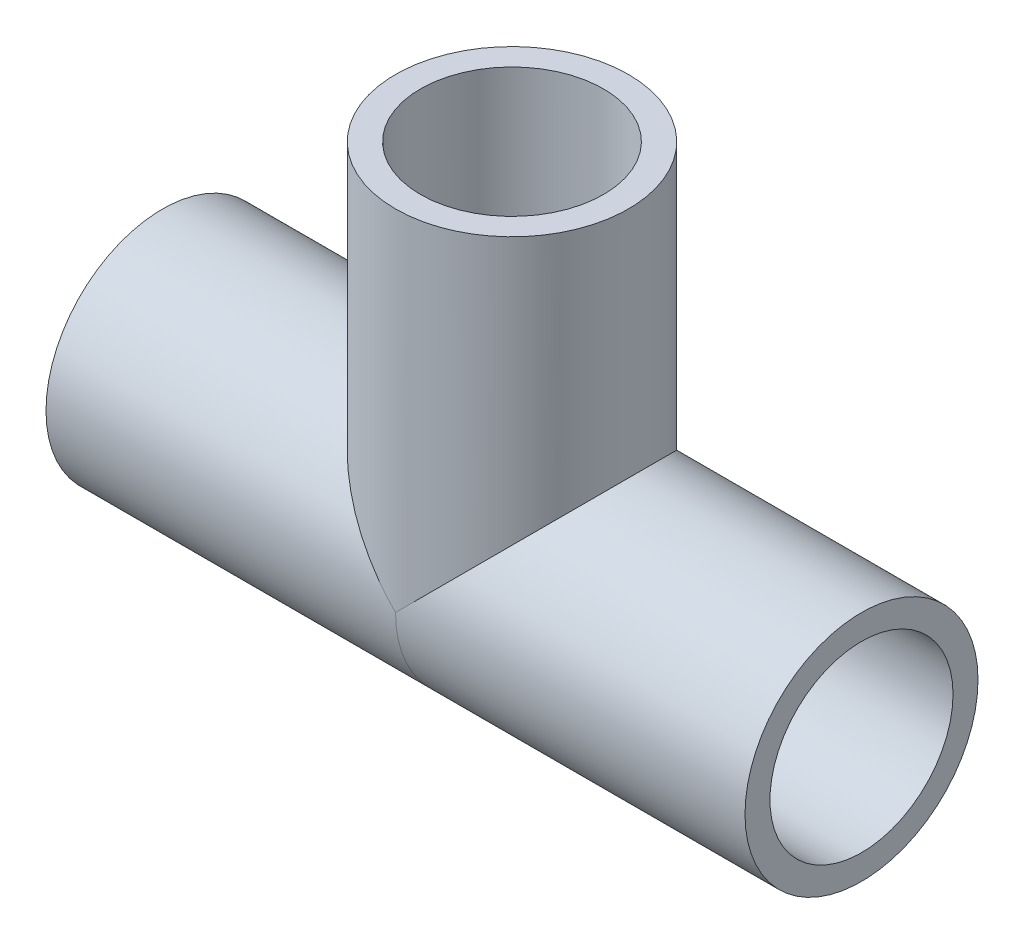
ISO-10303-21;
HEADER;
FILE_DESCRIPTION(('STEP AP214'),'2;1');
FILE_NAME('part.step','',(''),(''),'','','');
FILE_SCHEMA(('AUTOMOTIVE_DESIGN { 1 0 10303 214 1 1 1 1 }'));
ENDSEC;
DATA;
#1=APPLICATION_CONTEXT('core data for automotive mechanical design processes');
#2=APPLICATION_PROTOCOL_DEFINITION('international standard','automotive_design',2000,#1);
#3=PRODUCT_CONTEXT('',#1,'mechanical');
#4=PRODUCT('Part','Part','',(#3));
#5=PRODUCT_RELATED_PRODUCT_CATEGORY('part','',(#4));
#6=PRODUCT_DEFINITION_FORMATION('','',#4);
#7=PRODUCT_DEFINITION_CONTEXT('part definition',#1,'design');
#8=PRODUCT_DEFINITION('design','',#6,#7);
#9=PRODUCT_DEFINITION_SHAPE('','',#8);
#10=(LENGTH_UNIT() NAMED_UNIT(*) SI_UNIT(.MILLI.,.METRE.));
#11=(NAMED_UNIT(*) PLANE_ANGLE_UNIT() SI_UNIT($,.RADIAN.));
#12=(NAMED_UNIT(*) SI_UNIT($,.STERADIAN.) SOLID_ANGLE_UNIT());
#13=UNCERTAINTY_MEASURE_WITH_UNIT(LENGTH_MEASURE(1.E-05),#10,'distance_accuracy_value','');
#14=(GEOMETRIC_REPRESENTATION_CONTEXT(3) GLOBAL_UNCERTAINTY_ASSIGNED_CONTEXT((#13)) GLOBAL_UNIT_ASSIGNED_CONTEXT((#10,
#11,#12)) REPRESENTATION_CONTEXT('',''));
#15=CARTESIAN_POINT('',(0.,0.,0.));
#16=DIRECTION('',(0.,0.,1.));
#17=DIRECTION('',(1.,0.,0.));
#18=AXIS2_PLACEMENT_3D('',#15,#16,#17);
#19=CARTESIAN_POINT('',(0.,0.,0.));
#20=DIRECTION('',(1.,0.,0.));
#21=DIRECTION('',(0.,0.,-1.));
#22=AXIS2_PLACEMENT_3D('',#19,#20,#21);
#23=CYLINDRICAL_SURFACE('',#22,14.);
#24=CARTESIAN_POINT('',(0.,8.66025403784439,-11.));
#25=CARTESIAN_POINT('',(0.106731128079534,8.66024830088569,-11.0000017332594));
#26=CARTESIAN_POINT('',(0.213445997338714,8.66222805262621,-10.998446173261));
#27=CARTESIAN_POINT('',(0.426629238066452,8.67010290186351,-10.9922405757757));
#28=CARTESIAN_POINT('',(0.533097636184416,8.67599755412138,-10.9875908901815));
#29=CARTESIAN_POINT('',(0.851460278808503,8.69944251650661,-10.9690528829199));
#30=CARTESIAN_POINT('',(1.06270353861951,8.7227542420085,-10.9505754508928));
#31=CARTESIAN_POINT('',(1.47899799454272,8.78325161903006,-10.9021076708531));
#32=CARTESIAN_POINT('',(1.68409381234804,8.82025635177637,-10.8722673122349));
#33=CARTESIAN_POINT('',(2.08980908849464,8.90662558158331,-10.8016261292811));
#34=CARTESIAN_POINT('',(2.29042638122781,8.95599592287775,-10.7608201216938));
#35=CARTESIAN_POINT('',(2.75378051949326,9.08395463702161,-10.6532119300774));
#36=CARTESIAN_POINT('',(3.01439584695441,9.16676693446421,-10.582289435309));
#37=CARTESIAN_POINT('',(3.5250531453824,9.34713036181815,-10.4233195043346));
#38=CARTESIAN_POINT('',(3.77509160953487,9.44468633180179,-10.335266441746));
#39=CARTESIAN_POINT('',(4.26589442608583,9.6513199041552,-10.1425885876798));
#40=CARTESIAN_POINT('',(4.50658699854012,9.76046903842433,-10.0378586518454));
#41=CARTESIAN_POINT('',(4.9769628084531,9.98637164424519,-9.8131434150304));
#42=CARTESIAN_POINT('',(5.20664599034345,10.1031251541719,-9.69315803706134));
#43=CARTESIAN_POINT('',(5.72908730881709,10.3806804603309,-9.39655073763872));
#44=CARTESIAN_POINT('',(6.01768566863504,10.5433178939259,-9.21429549685575));
#45=CARTESIAN_POINT('',(6.57575122988704,10.8715053134242,-8.82469968309278));
#46=CARTESIAN_POINT('',(6.84521214223813,11.0370562346806,-8.61735092368064));
#47=CARTESIAN_POINT('',(7.36399934992373,11.366106287465,-8.17843155831272));
#48=CARTESIAN_POINT('',(7.61336012547486,11.5296085079831,-7.94690406641549));
#49=CARTESIAN_POINT('',(8.09133675103938,11.8506717291604,-7.45966907791159));
#50=CARTESIAN_POINT('',(8.31995911565775,12.008234586412,-7.2039692265287));
#51=CARTESIAN_POINT('',(8.71329868807419,12.2843770331498,-6.71983999837797));
#52=CARTESIAN_POINT('',(8.88188568497231,12.4046582487101,-6.49551728081253));
#53=CARTESIAN_POINT('',(9.20319887773541,12.6367131921778,-6.03164186920104));
#54=CARTESIAN_POINT('',(9.35592806020301,12.7484885209897,-5.79209205672163));
#55=CARTESIAN_POINT('',(9.64399495909991,12.9613748531958,-5.298576333832));
#56=CARTESIAN_POINT('',(9.77934984289455,13.0624963655267,-5.04462501685592));
#57=CARTESIAN_POINT('',(10.0312487863089,13.2521348887324,-4.52303833249301));
#58=CARTESIAN_POINT('',(10.1477958487217,13.3406539114118,-4.25540515850761));
#59=CARTESIAN_POINT('',(10.3437106555714,13.4903304151876,-3.75086008204436));
#60=CARTESIAN_POINT('',(10.4260428023242,13.5536017394337,-3.51572347913317));
#61=CARTESIAN_POINT('',(10.575164333928,13.6686446994817,-3.03784797691996));
#62=CARTESIAN_POINT('',(10.6419566030771,13.7204184692202,-2.79511049789251));
#63=CARTESIAN_POINT('',(10.7590812594305,13.8114616261147,-2.30347542862619));
#64=CARTESIAN_POINT('',(10.809419506124,13.850735464526,-2.05458006532866));
#65=CARTESIAN_POINT('',(10.8929128528025,13.9159933636478,-1.552187210586));
#66=CARTESIAN_POINT('',(10.9260677444971,13.9419772632624,-1.29868966339342));
#67=CARTESIAN_POINT('',(10.974735230419,13.980149642451,-0.788133211684806));
#68=CARTESIAN_POINT('',(10.9901903528931,13.9922931812923,-0.5310654334998));
#69=CARTESIAN_POINT('',(11.0030018322433,14.0023581380641,-0.0161982211066255));
#70=CARTESIAN_POINT('',(11.0003581556257,14.0002795296749,0.241601214454676));
#71=CARTESIAN_POINT('',(10.9770170956526,13.9819473820649,0.755884158963976));
#72=CARTESIAN_POINT('',(10.9563186927211,13.9656930423203,1.01236759277268));
#73=CARTESIAN_POINT('',(10.8972146834004,13.9193732301719,1.52201181425622));
#74=CARTESIAN_POINT('',(10.8588094128233,13.8893080196923,1.77517266485043));
#75=CARTESIAN_POINT('',(10.7672497242315,13.817846856854,2.26385270691459));
#76=CARTESIAN_POINT('',(10.7149254767354,13.7770900594857,2.49962243409077));
#77=CARTESIAN_POINT('',(10.5955256365938,13.6844344184766,2.96523560207745));
#78=CARTESIAN_POINT('',(10.5284449601242,13.632531735048,3.19507696990993));
#79=CARTESIAN_POINT('',(10.3803658758016,13.5184971693413,3.64755625366541));
#80=CARTESIAN_POINT('',(10.2993701015583,13.456367222796,3.87019552321967));
#81=CARTESIAN_POINT('',(10.1242855400506,13.322835710961,4.30747469800024));
#82=CARTESIAN_POINT('',(10.0301919716727,13.2514307606378,4.52211164568516));
#83=CARTESIAN_POINT('',(9.81980857267268,13.0928756038271,4.96356266235138));
#84=CARTESIAN_POINT('',(9.70224122125201,13.0048654319465,5.18945859761428));
#85=CARTESIAN_POINT('',(9.45340414578802,12.8202918652754,5.63002616804637));
#86=CARTESIAN_POINT('',(9.32212873758209,12.7237249248814,5.84469309118908));
#87=CARTESIAN_POINT('',(9.0469099735958,12.5234844900539,6.26226428165709));
#88=CARTESIAN_POINT('',(8.90296595572789,12.4198106242606,6.46516793328936));
#89=CARTESIAN_POINT('',(8.60327634683252,12.2067709402977,6.8589260489434));
#90=CARTESIAN_POINT('',(8.44752920439663,12.0974043744705,7.04977892294032));
#91=CARTESIAN_POINT('',(8.09209398136918,11.851678319556,7.4568872908164));
#92=CARTESIAN_POINT('',(7.88991832358022,11.7143589958994,7.67039631555792));
#93=CARTESIAN_POINT('',(7.47046953085865,11.4360516923653,8.07947622264012));
#94=CARTESIAN_POINT('',(7.25319382214966,11.2950630896401,8.27504403368867));
#95=CARTESIAN_POINT('',(6.80374455972686,11.0118308333744,8.64838598737889));
#96=CARTESIAN_POINT('',(6.57154276559283,10.8695852678004,8.82612466783534));
#97=CARTESIAN_POINT('',(6.09293871665621,10.5870941405582,9.16306399617248));
#98=CARTESIAN_POINT('',(5.8465383851615,10.4468483112049,9.32226714605889));
#99=CARTESIAN_POINT('',(5.37262492862935,10.1897416900707,9.60210478153764));
#100=CARTESIAN_POINT('',(5.14684217505071,10.0722172502024,9.72506128102127));
#101=CARTESIAN_POINT('',(4.68441504683003,9.84394750524297,9.95605610183598));
#102=CARTESIAN_POINT('',(4.44777039620315,9.73320237257099,10.0640940438286));
#103=CARTESIAN_POINT('',(3.96496128626993,9.52229171952135,10.263865714645));
#104=CARTESIAN_POINT('',(3.71885971952052,9.42206877753047,10.3556900259373));
#105=CARTESIAN_POINT('',(3.21603620307666,9.2351759678991,10.5227011613506));
#106=CARTESIAN_POINT('',(2.95931634864076,9.14850344239845,10.597891249412));
#107=CARTESIAN_POINT('',(2.48450833693737,9.00729650490908,10.718001381436));
#108=CARTESIAN_POINT('',(2.26807653995466,8.94978289610516,10.7659487333963));
#109=CARTESIAN_POINT('',(1.82962930536244,8.84884607239216,10.8490647255715));
#110=CARTESIAN_POINT('',(1.60761705901581,8.80541499320201,10.8842404992955));
#111=CARTESIAN_POINT('',(1.15613112466322,8.73420578581778,10.9414714994354));
#112=CARTESIAN_POINT('',(0.926596661356579,8.70665305624967,10.9633380294844));
#113=CARTESIAN_POINT('',(0.580350819371595,8.67891055266984,10.9852917435127));
#114=CARTESIAN_POINT('',(0.464476989410932,8.67192730080712,10.9908020395509));
#115=CARTESIAN_POINT('',(0.232409168854017,8.66259462320593,10.9981576831135));
#116=CARTESIAN_POINT('',(0.116215131019639,8.66024592235869,11.0000024573133));
#117=CARTESIAN_POINT('',(0.,8.66025403784456,11.));
#118=B_SPLINE_CURVE_WITH_KNOTS('',3,(#24,#25,#26,#27,#28,#29,#30,#31,#32,#33,#34,#35,#36,#37,
#38,#39,#40,#41,#42,#43,#44,#45,#46,#47,#48,#49,#50,#51,#52,#53,#54,#55,#56,#57,#58,#59,#60,#61,
#62,#63,#64,#65,#66,#67,#68,#69,#70,#71,#72,#73,#74,#75,#76,#77,#78,#79,#80,#81,#82,#83,#84,#85,
#86,#87,#88,#89,#90,#91,#92,#93,#94,#95,#96,#97,#98,#99,#100,#101,#102,#103,#104,#105,#106,#107,
#108,#109,#110,#111,#112,#113,#114,#115,#116,#117),.UNSPECIFIED.,.F.,.F.,(4,2,2,2,2,2,2,2,2,2,2,
2,2,2,2,2,2,2,2,2,2,2,2,2,2,2,2,2,2,2,2,2,2,2,2,2,2,2,2,2,2,2,2,2,2,2,4),(0.,0.320132143949103,
0.640227885726081,1.27924930889812,1.91011275915368,2.54127493256645,3.38746304395827,
4.23392954893934,5.08596112244158,5.93799699600133,7.07083864782147,8.20405087575384,
9.33527585695755,10.4661442442487,11.3812235661833,12.2961302316225,13.210125811994,
14.123975322242,14.8943221977522,15.6645259778152,16.4344551788161,17.2043937124009,
17.9768252369681,18.7492581910078,19.5217347682598,20.2941966960419,21.0281727048184,
21.7624019771133,22.4964924399392,23.2308515753941,24.0383947022898,24.8462740236332,
25.6541955915085,26.4622235377877,27.4348744451728,28.4076915476908,29.3824067384527,
30.3569902050436,31.2044142911096,32.0518599209082,32.8944099328409,33.7367944740457,
34.4230842989786,35.1089902078856,35.8044070707977,36.1529188844516,36.5014852046023),.UNSPECIFIED.);
#119=CARTESIAN_POINT('',(2.44948974278317,9.,10.7238052947636));
#120=VERTEX_POINT('',#119);
#121=CARTESIAN_POINT('',(0.,8.66025403784439,11.));
#122=VERTEX_POINT('',#121);
#123=EDGE_CURVE('E120',#120,#122,#118,.T.);
#124=ORIENTED_EDGE('',*,*,#123,.F.);
#125=DIRECTION('',(1.,0.,0.));
#126=VECTOR('',#125,1.);
#127=CARTESIAN_POINT('',(0.,9.,10.7238052947636));
#128=LINE('',#127,#126);
#129=CARTESIAN_POINT('',(0.,9.00000000000001,10.7238052947636));
#130=VERTEX_POINT('',#129);
#131=EDGE_CURVE('E103',#120,#130,#128,.F.);
#132=ORIENTED_EDGE('',*,*,#131,.T.);
#133=CARTESIAN_POINT('',(0.,0.,0.));
#134=DIRECTION('',(1.,0.,0.));
#135=DIRECTION('',(0.,0.,-1.));
#136=AXIS2_PLACEMENT_3D('',#133,#134,#135);
#137=CIRCLE('',#136,14.);
#138=EDGE_CURVE('E126',#130,#122,#137,.T.);
#139=ORIENTED_EDGE('',*,*,#138,.T.);
#140=EDGE_LOOP('',(#124,#132,#139));
#141=FACE_BOUND('',#140,.T.);
#142=ADVANCED_FACE('F32',(#141),#23,.T.);
#143=CARTESIAN_POINT('',(0.,8.66025403784438,-11.));
#144=VERTEX_POINT('',#143);
#145=CARTESIAN_POINT('',(0.,9.,-10.7238052947636));
#146=VERTEX_POINT('',#145);
#147=EDGE_CURVE('E211',#144,#146,#137,.T.);
#148=ORIENTED_EDGE('',*,*,#147,.T.);
#149=DIRECTION('',(1.,0.,0.));
#150=VECTOR('',#149,1.);
#151=CARTESIAN_POINT('',(0.,9.,-10.7238052947636));
#152=LINE('',#151,#150);
#153=CARTESIAN_POINT('',(2.44948974278317,9.,-10.7238052947636));
#154=VERTEX_POINT('',#153);
#155=EDGE_CURVE('E47',#146,#154,#152,.T.);
#156=ORIENTED_EDGE('',*,*,#155,.T.);
#157=EDGE_CURVE('E128',#144,#154,#118,.T.);
#158=ORIENTED_EDGE('',*,*,#157,.F.);
#159=EDGE_LOOP('',(#148,#156,#158));
#160=FACE_BOUND('',#159,.T.);
#161=ADVANCED_FACE('F182',(#160),#23,.T.);
#162=CARTESIAN_POINT('',(-42.,0.,0.));
#163=DIRECTION('',(1.,0.,0.));
#164=DIRECTION('',(0.,1.,0.));
#165=AXIS2_PLACEMENT_3D('',#162,#163,#164);
#166=CYLINDRICAL_SURFACE('',#165,14.);
#167=ORIENTED_EDGE('',*,*,#138,.F.);
#168=DIRECTION('',(1.,0.,0.));
#169=VECTOR('',#168,1.);
#170=CARTESIAN_POINT('',(-42.,9.,10.7238052947636));
#171=LINE('',#170,#169);
#172=CARTESIAN_POINT('',(-2.4494897427832,9.,10.7238052947636));
#173=VERTEX_POINT('',#172);
#174=EDGE_CURVE('E108',#130,#173,#171,.F.);
#175=ORIENTED_EDGE('',*,*,#174,.T.);
#176=CARTESIAN_POINT('',(0.,8.66025403784438,11.));
#177=CARTESIAN_POINT('',(-0.106731128079506,8.66024830088568,11.0000017332594));
#178=CARTESIAN_POINT('',(-0.213445997338686,8.6622280526262,10.998446173261));
#179=CARTESIAN_POINT('',(-0.426629238066422,8.6701029018635,10.9922405757758));
#180=CARTESIAN_POINT('',(-0.533097636184386,8.67599755412138,10.9875908901815));
#181=CARTESIAN_POINT('',(-0.851460278808472,8.69944251650661,10.9690528829199));
#182=CARTESIAN_POINT('',(-1.06270353861948,8.7227542420085,10.9505754508928));
#183=CARTESIAN_POINT('',(-1.47899799454268,8.78325161903005,10.9021076708531));
#184=CARTESIAN_POINT('',(-1.68409381234801,8.82025635177636,10.8722673122349));
#185=CARTESIAN_POINT('',(-2.0898090884946,8.9066255815833,10.8016261292811));
#186=CARTESIAN_POINT('',(-2.29042638122777,8.95599592287773,10.7608201216938));
#187=CARTESIAN_POINT('',(-2.75378051949322,9.08395463702159,10.6532119300775));
#188=CARTESIAN_POINT('',(-3.01439584695437,9.1667669344642,10.5822894353091));
#189=CARTESIAN_POINT('',(-3.52505314538236,9.34713036181814,10.4233195043346));
#190=CARTESIAN_POINT('',(-3.77509160953483,9.44468633180177,10.335266441746));
#191=CARTESIAN_POINT('',(-4.26589442608579,9.65131990415519,10.1425885876798));
#192=CARTESIAN_POINT('',(-4.50658699854008,9.7604690384243,10.0378586518454));
#193=CARTESIAN_POINT('',(-4.97696280845306,9.98637164424517,9.81314341503042));
#194=CARTESIAN_POINT('',(-5.20664599034341,10.1031251541719,9.69315803706136));
#195=CARTESIAN_POINT('',(-5.72908730881705,10.3806804603309,9.39655073763874));
#196=CARTESIAN_POINT('',(-6.01768566863501,10.5433178939259,9.21429549685577));
#197=CARTESIAN_POINT('',(-6.575751229887,10.8715053134242,8.82469968309281));
#198=CARTESIAN_POINT('',(-6.8452121422381,11.0370562346806,8.61735092368067));
#199=CARTESIAN_POINT('',(-7.36399934992369,11.366106287465,8.17843155831275));
#200=CARTESIAN_POINT('',(-7.61336012547483,11.5296085079831,7.94690406641551));
#201=CARTESIAN_POINT('',(-8.09133675103935,11.8506717291603,7.45966907791162));
#202=CARTESIAN_POINT('',(-8.31995911565772,12.008234586412,7.20396922652873));
#203=CARTESIAN_POINT('',(-8.71329868807416,12.2843770331498,6.719839998378));
#204=CARTESIAN_POINT('',(-8.88188568497229,12.4046582487101,6.49551728081257));
#205=CARTESIAN_POINT('',(-9.20319887773539,12.6367131921778,6.03164186920107));
#206=CARTESIAN_POINT('',(-9.35592806020298,12.7484885209896,5.79209205672167));
#207=CARTESIAN_POINT('',(-9.64399495909989,12.9613748531957,5.29857633383203));
#208=CARTESIAN_POINT('',(-9.77934984289453,13.0624963655266,5.04462501685595));
#209=CARTESIAN_POINT('',(-10.0312487863089,13.2521348887324,4.52303833249304));
#210=CARTESIAN_POINT('',(-10.1477958487217,13.3406539114118,4.25540515850764));
#211=CARTESIAN_POINT('',(-10.3437106555714,13.4903304151876,3.75086008204439));
#212=CARTESIAN_POINT('',(-10.4260428023242,13.5536017394337,3.51572347913321));
#213=CARTESIAN_POINT('',(-10.575164333928,13.6686446994817,3.03784797691999));
#214=CARTESIAN_POINT('',(-10.6419566030771,13.7204184692202,2.79511049789254));
#215=CARTESIAN_POINT('',(-10.7590812594305,13.8114616261147,2.30347542862623));
#216=CARTESIAN_POINT('',(-10.809419506124,13.850735464526,2.0545800653287));
#217=CARTESIAN_POINT('',(-10.8929128528025,13.9159933636478,1.55218721058604));
#218=CARTESIAN_POINT('',(-10.9260677444971,13.9419772632624,1.29868966339346));
#219=CARTESIAN_POINT('',(-10.974735230419,13.980149642451,0.788133211684839));
#220=CARTESIAN_POINT('',(-10.9901903528931,13.9922931812923,0.531065433499833));
#221=CARTESIAN_POINT('',(-11.0030018322433,14.0023581380641,0.0161982211066583));
#222=CARTESIAN_POINT('',(-11.0003581556257,14.0002795296749,-0.241601214454644));
#223=CARTESIAN_POINT('',(-10.9770170956526,13.9819473820649,-0.755884158963944));
#224=CARTESIAN_POINT('',(-10.9563186927211,13.9656930423203,-1.01236759277265));
#225=CARTESIAN_POINT('',(-10.8972146834004,13.9193732301719,-1.52201181425619));
#226=CARTESIAN_POINT('',(-10.8588094128233,13.8893080196923,-1.7751726648504));
#227=CARTESIAN_POINT('',(-10.7672497242315,13.817846856854,-2.26385270691456));
#228=CARTESIAN_POINT('',(-10.7149254767354,13.7770900594857,-2.49962243409074));
#229=CARTESIAN_POINT('',(-10.5955256365938,13.6844344184766,-2.96523560207742));
#230=CARTESIAN_POINT('',(-10.5284449601242,13.632531735048,-3.19507696990991));
#231=CARTESIAN_POINT('',(-10.3803658758016,13.5184971693413,-3.64755625366538));
#232=CARTESIAN_POINT('',(-10.2993701015583,13.456367222796,-3.87019552321964));
#233=CARTESIAN_POINT('',(-10.1242855400506,13.322835710961,-4.30747469800021));
#234=CARTESIAN_POINT('',(-10.0301919716727,13.2514307606378,-4.52211164568513));
#235=CARTESIAN_POINT('',(-9.81980857267269,13.0928756038271,-4.96356266235135));
#236=CARTESIAN_POINT('',(-9.70224122125203,13.0048654319465,-5.18945859761425));
#237=CARTESIAN_POINT('',(-9.45340414578803,12.8202918652754,-5.63002616804635));
#238=CARTESIAN_POINT('',(-9.32212873758211,12.7237249248814,-5.84469309118906));
#239=CARTESIAN_POINT('',(-9.04690997359582,12.5234844900539,-6.26226428165706));
#240=CARTESIAN_POINT('',(-8.90296595572791,12.4198106242606,-6.46516793328934));
#241=CARTESIAN_POINT('',(-8.60327634683254,12.2067709402977,-6.85892604894338));
#242=CARTESIAN_POINT('',(-8.44752920439666,12.0974043744705,-7.0497789229403));
#243=CARTESIAN_POINT('',(-8.0920939813692,11.851678319556,-7.45688729081638));
#244=CARTESIAN_POINT('',(-7.88991832358024,11.7143589958995,-7.6703963155579));
#245=CARTESIAN_POINT('',(-7.47046953085867,11.4360516923653,-8.0794762226401));
#246=CARTESIAN_POINT('',(-7.25319382214968,11.2950630896401,-8.27504403368865));
#247=CARTESIAN_POINT('',(-6.80374455972689,11.0118308333744,-8.64838598737887));
#248=CARTESIAN_POINT('',(-6.57154276559286,10.8695852678005,-8.82612466783532));
#249=CARTESIAN_POINT('',(-6.09293871665624,10.5870941405582,-9.16306399617246));
#250=CARTESIAN_POINT('',(-5.84653838516153,10.4468483112049,-9.32226714605887));
#251=CARTESIAN_POINT('',(-5.37262492862938,10.1897416900707,-9.60210478153762));
#252=CARTESIAN_POINT('',(-5.14684217505074,10.0722172502025,-9.72506128102125));
#253=CARTESIAN_POINT('',(-4.68441504683006,9.84394750524299,-9.95605610183597));
#254=CARTESIAN_POINT('',(-4.44777039620317,9.733202372571,-10.0640940438286));
#255=CARTESIAN_POINT('',(-3.96496128626996,9.52229171952135,-10.263865714645));
#256=CARTESIAN_POINT('',(-3.71885971952055,9.42206877753048,-10.3556900259373));
#257=CARTESIAN_POINT('',(-3.21603620307668,9.23517596789911,-10.5227011613506));
#258=CARTESIAN_POINT('',(-2.95931634864078,9.14850344239845,-10.597891249412));
#259=CARTESIAN_POINT('',(-2.48450833693738,9.00729650490908,-10.718001381436));
#260=CARTESIAN_POINT('',(-2.26807653995467,8.94978289610516,-10.7659487333963));
#261=CARTESIAN_POINT('',(-1.82962930536244,8.84884607239215,-10.8490647255715));
#262=CARTESIAN_POINT('',(-1.60761705901581,8.80541499320201,-10.8842404992955));
#263=CARTESIAN_POINT('',(-1.15613112466321,8.73420578581778,-10.9414714994354));
#264=CARTESIAN_POINT('',(-0.926596661356563,8.70665305624967,-10.9633380294844));
#265=CARTESIAN_POINT('',(-0.580350819371573,8.67891055266983,-10.9852917435127));
#266=CARTESIAN_POINT('',(-0.464476989410907,8.67192730080712,-10.9908020395509));
#267=CARTESIAN_POINT('',(-0.23240916885399,8.66259462320592,-10.9981576831135));
#268=CARTESIAN_POINT('',(-0.116215131019612,8.66024592235868,-11.0000024573133));
#269=CARTESIAN_POINT('',(0.,8.66025403784456,-11.));
#270=B_SPLINE_CURVE_WITH_KNOTS('',3,(#176,#177,#178,#179,#180,#181,#182,#183,#184,#185,#186,
#187,#188,#189,#190,#191,#192,#193,#194,#195,#196,#197,#198,#199,#200,#201,#202,#203,#204,#205,
#206,#207,#208,#209,#210,#211,#212,#213,#214,#215,#216,#217,#218,#219,#220,#221,#222,#223,#224,
#225,#226,#227,#228,#229,#230,#231,#232,#233,#234,#235,#236,#237,#238,#239,#240,#241,#242,#243,
#244,#245,#246,#247,#248,#249,#250,#251,#252,#253,#254,#255,#256,#257,#258,#259,#260,#261,#262,
#263,#264,#265,#266,#267,#268,#269),.UNSPECIFIED.,.F.,.F.,(4,2,2,2,2,2,2,2,2,2,2,2,2,2,2,2,2,2,
2,2,2,2,2,2,2,2,2,2,2,2,2,2,2,2,2,2,2,2,2,2,2,2,2,2,2,2,4),(0.,0.320132143949102,
0.640227885726078,1.27924930889811,1.91011275915367,2.54127493256644,3.38746304395826,
4.23392954893932,5.08596112244156,5.9379969960013,7.07083864782145,8.20405087575382,
9.33527585695752,10.4661442442487,11.3812235661832,12.2961302316225,13.210125811994,
14.123975322242,14.8943221977522,15.6645259778152,16.4344551788161,17.2043937124009,
17.9768252369681,18.7492581910078,19.5217347682598,20.2941966960419,21.0281727048183,
21.7624019771133,22.4964924399392,23.2308515753941,24.0383947022898,24.8462740236332,
25.6541955915085,26.4622235377877,27.4348744451728,28.4076915476908,29.3824067384527,
30.3569902050436,31.2044142911096,32.0518599209082,32.8944099328409,33.7367944740457,
34.4230842989786,35.1089902078856,35.8044070707978,36.1529188844516,36.5014852046023),.UNSPECIFIED.);
#271=EDGE_CURVE('E142',#122,#173,#270,.T.);
#272=ORIENTED_EDGE('',*,*,#271,.F.);
#273=EDGE_LOOP('',(#167,#175,#272));
#274=FACE_BOUND('',#273,.T.);
#275=ADVANCED_FACE('F179',(#274),#166,.T.);
#276=CARTESIAN_POINT('',(-2.4494897427832,9.,-10.7238052947636));
#277=VERTEX_POINT('',#276);
#278=EDGE_CURVE('E132',#277,#144,#270,.T.);
#279=ORIENTED_EDGE('',*,*,#278,.F.);
#280=DIRECTION('',(1.,0.,0.));
#281=VECTOR('',#280,1.);
#282=CARTESIAN_POINT('',(-42.,9.,-10.7238052947636));
#283=LINE('',#282,#281);
#284=EDGE_CURVE('E234',#277,#146,#283,.T.);
#285=ORIENTED_EDGE('',*,*,#284,.T.);
#286=ORIENTED_EDGE('',*,*,#147,.F.);
#287=EDGE_LOOP('',(#279,#285,#286));
#288=FACE_BOUND('',#287,.T.);
#289=ADVANCED_FACE('F167',(#288),#166,.T.);
#290=CARTESIAN_POINT('',(-42.,0.,0.));
#291=DIRECTION('',(1.,0.,0.));
#292=DIRECTION('',(0.,1.,0.));
#293=AXIS2_PLACEMENT_3D('',#290,#291,#292);
#294=CYLINDRICAL_SURFACE('',#293,11.);
#295=CARTESIAN_POINT('',(-42.,0.,0.));
#296=DIRECTION('',(1.,0.,0.));
#297=DIRECTION('',(0.,0.,-1.));
#298=AXIS2_PLACEMENT_3D('',#295,#296,#297);
#299=CIRCLE('',#298,11.);
#300=CARTESIAN_POINT('',(-42.,0.,-11.));
#301=VERTEX_POINT('',#300);
#302=EDGE_CURVE('E220',#301,#301,#299,.F.);
#303=ORIENTED_EDGE('',*,*,#302,.T.);
#304=EDGE_LOOP('',(#303));
#305=FACE_BOUND('',#304,.T.);
#306=CARTESIAN_POINT('',(0.,0.,0.));
#307=DIRECTION('',(0.707106781186547,0.707106781186547,0.));
#308=DIRECTION('',(0.707106781186548,-0.707106781186547,0.));
#309=AXIS2_PLACEMENT_3D('',#306,#307,#308);
#310=ELLIPSE('',#309,15.556349186104,11.);
#311=CARTESIAN_POINT('',(-9.00000000000001,9.,6.32455532033675));
#312=VERTEX_POINT('',#311);
#313=CARTESIAN_POINT('',(-9.00000000000001,9.,-6.32455532033675));
#314=VERTEX_POINT('',#313);
#315=EDGE_CURVE('E113',#312,#314,#310,.F.);
#316=ORIENTED_EDGE('',*,*,#315,.F.);
#317=DIRECTION('',(1.,0.,0.));
#318=VECTOR('',#317,1.);
#319=CARTESIAN_POINT('',(-42.,9.,6.32455532033675));
#320=LINE('',#319,#318);
#321=CARTESIAN_POINT('',(0.,9.,6.32455532033676));
#322=VERTEX_POINT('',#321);
#323=EDGE_CURVE('E235',#312,#322,#320,.T.);
#324=ORIENTED_EDGE('',*,*,#323,.T.);
#325=CARTESIAN_POINT('',(0.,0.,0.));
#326=DIRECTION('',(1.,0.,0.));
#327=DIRECTION('',(0.,0.,-1.));
#328=AXIS2_PLACEMENT_3D('',#325,#326,#327);
#329=CIRCLE('',#328,11.);
#330=CARTESIAN_POINT('',(0.,9.,-6.32455532033675));
#331=VERTEX_POINT('',#330);
#332=EDGE_CURVE('E227',#331,#322,#329,.F.);
#333=ORIENTED_EDGE('',*,*,#332,.F.);
#334=DIRECTION('',(1.,0.,0.));
#335=VECTOR('',#334,1.);
#336=CARTESIAN_POINT('',(-42.,9.,-6.32455532033675));
#337=LINE('',#336,#335);
#338=EDGE_CURVE('E54',#331,#314,#337,.F.);
#339=ORIENTED_EDGE('',*,*,#338,.T.);
#340=EDGE_LOOP('',(#316,#324,#333,#339));
#341=FACE_BOUND('',#340,.T.);
#342=ADVANCED_FACE('F163',(#305,#341),#294,.F.);
#343=CARTESIAN_POINT('',(0.,0.,0.));
#344=DIRECTION('',(1.,0.,0.));
#345=DIRECTION('',(0.,0.,-1.));
#346=AXIS2_PLACEMENT_3D('',#343,#344,#345);
#347=CYLINDRICAL_SURFACE('',#346,11.);
#348=CARTESIAN_POINT('',(42.,0.,0.));
#349=DIRECTION('',(1.,0.,0.));
#350=DIRECTION('',(0.,0.,-1.));
#351=AXIS2_PLACEMENT_3D('',#348,#349,#350);
#352=CIRCLE('',#351,11.);
#353=CARTESIAN_POINT('',(42.,0.,-11.));
#354=VERTEX_POINT('',#353);
#355=EDGE_CURVE('E223',#354,#354,#352,.F.);
#356=ORIENTED_EDGE('',*,*,#355,.F.);
#357=EDGE_LOOP('',(#356));
#358=FACE_BOUND('',#357,.T.);
#359=ORIENTED_EDGE('',*,*,#332,.T.);
#360=DIRECTION('',(1.,0.,0.));
#361=VECTOR('',#360,1.);
#362=CARTESIAN_POINT('',(0.,9.,6.32455532033676));
#363=LINE('',#362,#361);
#364=CARTESIAN_POINT('',(9.,9.,6.32455532033676));
#365=VERTEX_POINT('',#364);
#366=EDGE_CURVE('E11',#322,#365,#363,.T.);
#367=ORIENTED_EDGE('',*,*,#366,.T.);
#368=CARTESIAN_POINT('',(0.,0.,0.));
#369=DIRECTION('',(0.707106781186547,-0.707106781186547,0.));
#370=DIRECTION('',(0.707106781186547,0.707106781186547,0.));
#371=AXIS2_PLACEMENT_3D('',#368,#369,#370);
#372=ELLIPSE('',#371,15.556349186104,11.);
#373=CARTESIAN_POINT('',(9.,9.,-6.32455532033676));
#374=VERTEX_POINT('',#373);
#375=EDGE_CURVE('E40',#374,#365,#372,.T.);
#376=ORIENTED_EDGE('',*,*,#375,.F.);
#377=DIRECTION('',(1.,0.,0.));
#378=VECTOR('',#377,1.);
#379=CARTESIAN_POINT('',(0.,9.,-6.32455532033676));
#380=LINE('',#379,#378);
#381=EDGE_CURVE('E226',#374,#331,#380,.F.);
#382=ORIENTED_EDGE('',*,*,#381,.T.);
#383=EDGE_LOOP('',(#359,#367,#376,#382));
#384=FACE_BOUND('',#383,.T.);
#385=ADVANCED_FACE('F166',(#358,#384),#347,.F.);
#386=CARTESIAN_POINT('',(-42.,0.,0.));
#387=DIRECTION('',(1.,0.,0.));
#388=DIRECTION('',(0.,0.,-1.));
#389=AXIS2_PLACEMENT_3D('',#386,#387,#388);
#390=CIRCLE('',#389,14.);
#391=CARTESIAN_POINT('',(-42.,0.,-14.));
#392=VERTEX_POINT('',#391);
#393=EDGE_CURVE('E216',#392,#392,#390,.T.);
#394=ORIENTED_EDGE('',*,*,#393,.T.);
#395=EDGE_LOOP('',(#394));
#396=FACE_BOUND('',#395,.T.);
#397=CARTESIAN_POINT('',(0.,0.,14.));
#398=VERTEX_POINT('',#397);
#399=CARTESIAN_POINT('',(0.,0.,-14.));
#400=VERTEX_POINT('',#399);
#401=EDGE_CURVE('E205',#398,#400,#137,.T.);
#402=ORIENTED_EDGE('',*,*,#401,.F.);
#403=CARTESIAN_POINT('',(0.,0.,0.));
#404=DIRECTION('',(0.707106781186547,0.707106781186547,0.));
#405=DIRECTION('',(0.707106781186548,-0.707106781186547,0.));
#406=AXIS2_PLACEMENT_3D('',#403,#404,#405);
#407=ELLIPSE('',#406,19.7989898732233,14.);
#408=EDGE_CURVE('E209',#398,#400,#407,.F.);
#409=ORIENTED_EDGE('',*,*,#408,.T.);
#410=EDGE_LOOP('',(#402,#409));
#411=FACE_BOUND('',#410,.T.);
#412=ADVANCED_FACE('F171',(#396,#411),#166,.T.);
#413=CARTESIAN_POINT('',(42.,0.,0.));
#414=DIRECTION('',(1.,0.,0.));
#415=DIRECTION('',(0.,0.,-1.));
#416=AXIS2_PLACEMENT_3D('',#413,#414,#415);
#417=CIRCLE('',#416,14.);
#418=CARTESIAN_POINT('',(42.,0.,-14.));
#419=VERTEX_POINT('',#418);
#420=EDGE_CURVE('E201',#419,#419,#417,.T.);
#421=ORIENTED_EDGE('',*,*,#420,.F.);
#422=EDGE_LOOP('',(#421));
#423=FACE_BOUND('',#422,.T.);
#424=ORIENTED_EDGE('',*,*,#401,.T.);
#425=CARTESIAN_POINT('',(0.,0.,0.));
#426=DIRECTION('',(0.707106781186548,-0.707106781186547,0.));
#427=DIRECTION('',(0.707106781186548,0.707106781186547,0.));
#428=AXIS2_PLACEMENT_3D('',#425,#426,#427);
#429=ELLIPSE('',#428,19.7989898732233,14.);
#430=EDGE_CURVE('E206',#400,#398,#429,.T.);
#431=ORIENTED_EDGE('',*,*,#430,.T.);
#432=EDGE_LOOP('',(#424,#431));
#433=FACE_BOUND('',#432,.T.);
#434=ADVANCED_FACE('F176',(#423,#433),#23,.T.);
#435=CARTESIAN_POINT('',(-42.,0.,0.));
#436=DIRECTION('',(1.,0.,0.));
#437=DIRECTION('',(0.,0.,-1.));
#438=AXIS2_PLACEMENT_3D('',#435,#436,#437);
#439=PLANE('',#438);
#440=ORIENTED_EDGE('',*,*,#302,.F.);
#441=EDGE_LOOP('',(#440));
#442=FACE_BOUND('',#441,.T.);
#443=ORIENTED_EDGE('',*,*,#393,.F.);
#444=EDGE_LOOP('',(#443));
#445=FACE_BOUND('',#444,.T.);
#446=ADVANCED_FACE('F162',(#442,#445),#439,.F.);
#447=CARTESIAN_POINT('',(42.,0.,0.));
#448=DIRECTION('',(1.,0.,0.));
#449=DIRECTION('',(0.,0.,-1.));
#450=AXIS2_PLACEMENT_3D('',#447,#448,#449);
#451=PLANE('',#450);
#452=ORIENTED_EDGE('',*,*,#355,.T.);
#453=EDGE_LOOP('',(#452));
#454=FACE_BOUND('',#453,.T.);
#455=ORIENTED_EDGE('',*,*,#420,.T.);
#456=EDGE_LOOP('',(#455));
#457=FACE_BOUND('',#456,.T.);
#458=ADVANCED_FACE('F160',(#454,#457),#451,.T.);
#459=CARTESIAN_POINT('',(0.,42.,0.));
#460=DIRECTION('',(0.,-1.,0.));
#461=DIRECTION('',(0.,0.,-1.));
#462=AXIS2_PLACEMENT_3D('',#459,#460,#461);
#463=CYLINDRICAL_SURFACE('',#462,14.);
#464=ORIENTED_EDGE('',*,*,#408,.F.);
#465=ORIENTED_EDGE('',*,*,#430,.F.);
#466=EDGE_LOOP('',(#464,#465));
#467=FACE_BOUND('',#466,.T.);
#468=CARTESIAN_POINT('',(0.,42.,0.));
#469=DIRECTION('',(0.,1.,0.));
#470=DIRECTION('',(0.,0.,1.));
#471=AXIS2_PLACEMENT_3D('',#468,#469,#470);
#472=CIRCLE('',#471,14.);
#473=CARTESIAN_POINT('',(0.,42.,14.));
#474=VERTEX_POINT('',#473);
#475=EDGE_CURVE('E129',#474,#474,#472,.T.);
#476=ORIENTED_EDGE('',*,*,#475,.F.);
#477=EDGE_LOOP('',(#476));
#478=FACE_BOUND('',#477,.T.);
#479=ADVANCED_FACE('F152',(#467,#478),#463,.T.);
#480=CARTESIAN_POINT('',(0.,42.,0.));
#481=DIRECTION('',(0.,-1.,0.));
#482=DIRECTION('',(0.,0.,-1.));
#483=AXIS2_PLACEMENT_3D('',#480,#481,#482);
#484=CYLINDRICAL_SURFACE('',#483,11.);
#485=CARTESIAN_POINT('',(0.,9.,0.));
#486=DIRECTION('',(0.,1.,0.));
#487=DIRECTION('',(0.,0.,1.));
#488=AXIS2_PLACEMENT_3D('',#485,#486,#487);
#489=CIRCLE('',#488,11.);
#490=EDGE_CURVE('E233',#277,#314,#489,.T.);
#491=ORIENTED_EDGE('',*,*,#490,.F.);
#492=ORIENTED_EDGE('',*,*,#278,.T.);
#493=ORIENTED_EDGE('',*,*,#157,.T.);
#494=EDGE_CURVE('E123',#374,#154,#489,.T.);
#495=ORIENTED_EDGE('',*,*,#494,.F.);
#496=ORIENTED_EDGE('',*,*,#375,.T.);
#497=EDGE_CURVE('E106',#120,#365,#489,.T.);
#498=ORIENTED_EDGE('',*,*,#497,.F.);
#499=ORIENTED_EDGE('',*,*,#123,.T.);
#500=ORIENTED_EDGE('',*,*,#271,.T.);
#501=EDGE_CURVE('E125',#312,#173,#489,.T.);
#502=ORIENTED_EDGE('',*,*,#501,.F.);
#503=ORIENTED_EDGE('',*,*,#315,.T.);
#504=EDGE_LOOP('',(#491,#492,#493,#495,#496,#498,#499,#500,#502,#503));
#505=FACE_BOUND('',#504,.T.);
#506=CARTESIAN_POINT('',(0.,42.,0.));
#507=DIRECTION('',(0.,1.,0.));
#508=DIRECTION('',(0.,0.,1.));
#509=AXIS2_PLACEMENT_3D('',#506,#507,#508);
#510=CIRCLE('',#509,11.);
#511=CARTESIAN_POINT('',(0.,42.,11.));
#512=VERTEX_POINT('',#511);
#513=EDGE_CURVE('E134',#512,#512,#510,.T.);
#514=ORIENTED_EDGE('',*,*,#513,.T.);
#515=EDGE_LOOP('',(#514));
#516=FACE_BOUND('',#515,.T.);
#517=ADVANCED_FACE('F117',(#505,#516),#484,.F.);
#518=CARTESIAN_POINT('',(0.,42.,0.));
#519=DIRECTION('',(0.,1.,0.));
#520=DIRECTION('',(0.,0.,1.));
#521=AXIS2_PLACEMENT_3D('',#518,#519,#520);
#522=PLANE('',#521);
#523=ORIENTED_EDGE('',*,*,#475,.T.);
#524=EDGE_LOOP('',(#523));
#525=FACE_BOUND('',#524,.T.);
#526=ORIENTED_EDGE('',*,*,#513,.F.);
#527=EDGE_LOOP('',(#526));
#528=FACE_BOUND('',#527,.T.);
#529=ADVANCED_FACE('F151',(#525,#528),#522,.T.);
#530=CARTESIAN_POINT('',(0.,9.,0.));
#531=DIRECTION('',(0.,1.,0.));
#532=DIRECTION('',(0.,0.,1.));
#533=AXIS2_PLACEMENT_3D('',#530,#531,#532);
#534=PLANE('',#533);
#535=ORIENTED_EDGE('',*,*,#497,.T.);
#536=ORIENTED_EDGE('',*,*,#366,.F.);
#537=ORIENTED_EDGE('',*,*,#323,.F.);
#538=ORIENTED_EDGE('',*,*,#501,.T.);
#539=ORIENTED_EDGE('',*,*,#174,.F.);
#540=ORIENTED_EDGE('',*,*,#131,.F.);
#541=EDGE_LOOP('',(#535,#536,#537,#538,#539,#540));
#542=FACE_BOUND('',#541,.T.);
#543=ADVANCED_FACE('F105',(#542),#534,.T.);
#544=ORIENTED_EDGE('',*,*,#284,.F.);
#545=ORIENTED_EDGE('',*,*,#490,.T.);
#546=ORIENTED_EDGE('',*,*,#338,.F.);
#547=ORIENTED_EDGE('',*,*,#381,.F.);
#548=ORIENTED_EDGE('',*,*,#494,.T.);
#549=ORIENTED_EDGE('',*,*,#155,.F.);
#550=EDGE_LOOP('',(#544,#545,#546,#547,#548,#549));
#551=FACE_BOUND('',#550,.T.);
#552=ADVANCED_FACE('F153',(#551),#534,.T.);
#553=CLOSED_SHELL('',(#142,#161,#275,#289,#342,#385,#412,#434,#446,#458,#479,#517,#529,#543,#552));
#554=MANIFOLD_SOLID_BREP('B2',#553);
#555=ADVANCED_BREP_SHAPE_REPRESENTATION('',(#18,#554),#14);
#556=SHAPE_DEFINITION_REPRESENTATION(#9,#555);
ENDSEC;
END-ISO-10303-21;
